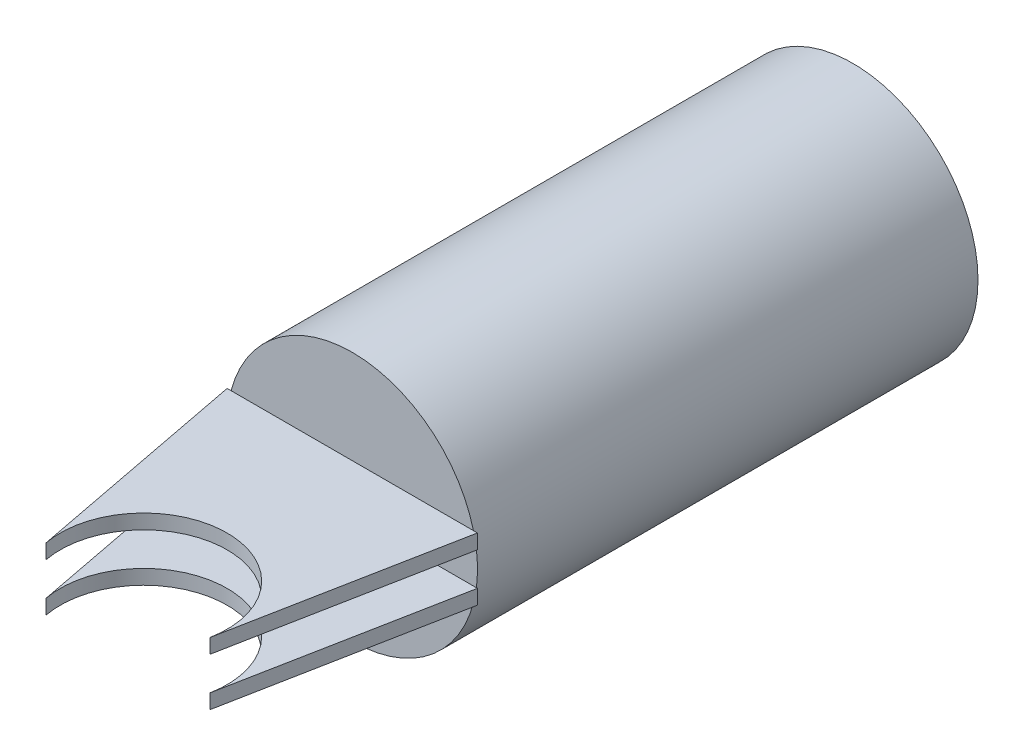
ISO-10303-21;
HEADER;
FILE_DESCRIPTION(('STEP AP214'),'2;1');
FILE_NAME('part.step','',(''),(''),'','','');
FILE_SCHEMA(('AUTOMOTIVE_DESIGN { 1 0 10303 214 1 1 1 1 }'));
ENDSEC;
DATA;
#1=APPLICATION_CONTEXT('core data for automotive mechanical design processes');
#2=APPLICATION_PROTOCOL_DEFINITION('international standard','automotive_design',2000,#1);
#3=PRODUCT_CONTEXT('',#1,'mechanical');
#4=PRODUCT('Part','Part','',(#3));
#5=PRODUCT_RELATED_PRODUCT_CATEGORY('part','',(#4));
#6=PRODUCT_DEFINITION_FORMATION('','',#4);
#7=PRODUCT_DEFINITION_CONTEXT('part definition',#1,'design');
#8=PRODUCT_DEFINITION('design','',#6,#7);
#9=PRODUCT_DEFINITION_SHAPE('','',#8);
#10=(LENGTH_UNIT() NAMED_UNIT(*) SI_UNIT(.MILLI.,.METRE.));
#11=(NAMED_UNIT(*) PLANE_ANGLE_UNIT() SI_UNIT($,.RADIAN.));
#12=(NAMED_UNIT(*) SI_UNIT($,.STERADIAN.) SOLID_ANGLE_UNIT());
#13=UNCERTAINTY_MEASURE_WITH_UNIT(LENGTH_MEASURE(1.E-05),#10,'distance_accuracy_value','');
#14=(GEOMETRIC_REPRESENTATION_CONTEXT(3) GLOBAL_UNCERTAINTY_ASSIGNED_CONTEXT((#13)) GLOBAL_UNIT_ASSIGNED_CONTEXT((#10,
#11,#12)) REPRESENTATION_CONTEXT('',''));
#15=CARTESIAN_POINT('',(0.,0.,0.));
#16=DIRECTION('',(0.,0.,1.));
#17=DIRECTION('',(1.,0.,0.));
#18=AXIS2_PLACEMENT_3D('',#15,#16,#17);
#19=CARTESIAN_POINT('',(0.,0.,0.));
#20=DIRECTION('',(0.,0.,1.));
#21=DIRECTION('',(1.,0.,0.));
#22=AXIS2_PLACEMENT_3D('',#19,#20,#21);
#23=PLANE('',#22);
#24=CARTESIAN_POINT('',(0.,0.,0.));
#25=DIRECTION('',(0.,0.,1.));
#26=DIRECTION('',(1.,0.,0.));
#27=AXIS2_PLACEMENT_3D('',#24,#25,#26);
#28=CIRCLE('',#27,30.);
#29=CARTESIAN_POINT('',(-29.0473750965556,-7.5,0.));
#30=VERTEX_POINT('',#29);
#31=CARTESIAN_POINT('',(29.0473750965556,-7.5,0.));
#32=VERTEX_POINT('',#31);
#33=EDGE_CURVE('E216',#30,#32,#28,.T.);
#34=ORIENTED_EDGE('',*,*,#33,.T.);
#35=DIRECTION('',(-1.,0.,0.));
#36=VECTOR('',#35,1.);
#37=CARTESIAN_POINT('',(30.,-7.5,0.));
#38=LINE('',#37,#36);
#39=EDGE_CURVE('E59',#32,#30,#38,.T.);
#40=ORIENTED_EDGE('',*,*,#39,.T.);
#41=EDGE_LOOP('',(#34,#40));
#42=FACE_BOUND('',#41,.T.);
#43=ADVANCED_FACE('F34',(#42),#23,.T.);
#44=DIRECTION('',(-1.,0.,0.));
#45=VECTOR('',#44,1.);
#46=CARTESIAN_POINT('',(30.,-4.,0.));
#47=LINE('',#46,#45);
#48=CARTESIAN_POINT('',(29.732137494637,-4.,0.));
#49=VERTEX_POINT('',#48);
#50=CARTESIAN_POINT('',(-29.732137494637,-4.,0.));
#51=VERTEX_POINT('',#50);
#52=EDGE_CURVE('E165',#49,#51,#47,.T.);
#53=ORIENTED_EDGE('',*,*,#52,.F.);
#54=CARTESIAN_POINT('',(29.732137494637,4.,0.));
#55=VERTEX_POINT('',#54);
#56=EDGE_CURVE('E202',#49,#55,#28,.T.);
#57=ORIENTED_EDGE('',*,*,#56,.T.);
#58=DIRECTION('',(-1.,0.,0.));
#59=VECTOR('',#58,1.);
#60=CARTESIAN_POINT('',(30.,4.,0.));
#61=LINE('',#60,#59);
#62=CARTESIAN_POINT('',(-29.732137494637,4.,0.));
#63=VERTEX_POINT('',#62);
#64=EDGE_CURVE('E11',#55,#63,#61,.T.);
#65=ORIENTED_EDGE('',*,*,#64,.T.);
#66=EDGE_CURVE('E221',#63,#51,#28,.T.);
#67=ORIENTED_EDGE('',*,*,#66,.T.);
#68=EDGE_LOOP('',(#53,#57,#65,#67));
#69=FACE_BOUND('',#68,.T.);
#70=ADVANCED_FACE('F255',(#69),#23,.T.);
#71=CARTESIAN_POINT('',(0.,0.,-120.));
#72=DIRECTION('',(0.,0.,1.));
#73=DIRECTION('',(1.,0.,0.));
#74=AXIS2_PLACEMENT_3D('',#71,#72,#73);
#75=CYLINDRICAL_SURFACE('',#74,30.);
#76=CARTESIAN_POINT('',(0.,0.,-120.));
#77=DIRECTION('',(0.,0.,1.));
#78=DIRECTION('',(1.,0.,0.));
#79=AXIS2_PLACEMENT_3D('',#76,#77,#78);
#80=CIRCLE('',#79,30.);
#81=CARTESIAN_POINT('',(30.,0.,-120.));
#82=VERTEX_POINT('',#81);
#83=EDGE_CURVE('E203',#82,#82,#80,.T.);
#84=ORIENTED_EDGE('',*,*,#83,.T.);
#85=EDGE_LOOP('',(#84));
#86=FACE_BOUND('',#85,.T.);
#87=CARTESIAN_POINT('',(29.0473750965556,7.5,0.));
#88=VERTEX_POINT('',#87);
#89=EDGE_CURVE('E38',#55,#88,#28,.T.);
#90=ORIENTED_EDGE('',*,*,#89,.F.);
#91=ORIENTED_EDGE('',*,*,#56,.F.);
#92=EDGE_CURVE('E53',#32,#49,#28,.T.);
#93=ORIENTED_EDGE('',*,*,#92,.F.);
#94=ORIENTED_EDGE('',*,*,#33,.F.);
#95=EDGE_CURVE('E219',#51,#30,#28,.T.);
#96=ORIENTED_EDGE('',*,*,#95,.F.);
#97=ORIENTED_EDGE('',*,*,#66,.F.);
#98=CARTESIAN_POINT('',(-29.0473750965556,7.5,0.));
#99=VERTEX_POINT('',#98);
#100=EDGE_CURVE('E213',#99,#63,#28,.T.);
#101=ORIENTED_EDGE('',*,*,#100,.F.);
#102=EDGE_CURVE('E209',#88,#99,#28,.T.);
#103=ORIENTED_EDGE('',*,*,#102,.F.);
#104=EDGE_LOOP('',(#90,#91,#93,#94,#96,#97,#101,#103));
#105=FACE_BOUND('',#104,.T.);
#106=ADVANCED_FACE('F36',(#86,#105),#75,.T.);
#107=CARTESIAN_POINT('',(0.,0.,-120.));
#108=DIRECTION('',(0.,0.,1.));
#109=DIRECTION('',(1.,0.,0.));
#110=AXIS2_PLACEMENT_3D('',#107,#108,#109);
#111=PLANE('',#110);
#112=ORIENTED_EDGE('',*,*,#83,.F.);
#113=EDGE_LOOP('',(#112));
#114=FACE_BOUND('',#113,.T.);
#115=ADVANCED_FACE('F280',(#114),#111,.F.);
#116=DIRECTION('',(-1.,0.,0.));
#117=VECTOR('',#116,1.);
#118=CARTESIAN_POINT('',(30.,7.5,0.));
#119=LINE('',#118,#117);
#120=EDGE_CURVE('E43',#88,#99,#119,.T.);
#121=ORIENTED_EDGE('',*,*,#120,.F.);
#122=ORIENTED_EDGE('',*,*,#102,.T.);
#123=EDGE_LOOP('',(#121,#122));
#124=FACE_BOUND('',#123,.T.);
#125=ADVANCED_FACE('F253',(#124),#23,.T.);
#126=CARTESIAN_POINT('',(30.,7.5,0.));
#127=DIRECTION('',(0.,0.,1.));
#128=DIRECTION('',(1.,0.,0.));
#129=AXIS2_PLACEMENT_3D('',#126,#127,#128);
#130=PLANE('',#129);
#131=CARTESIAN_POINT('',(30.,4.,0.));
#132=VERTEX_POINT('',#131);
#133=EDGE_CURVE('E45',#132,#55,#61,.T.);
#134=ORIENTED_EDGE('',*,*,#133,.T.);
#135=ORIENTED_EDGE('',*,*,#89,.T.);
#136=CARTESIAN_POINT('',(30.,7.5,0.));
#137=VERTEX_POINT('',#136);
#138=EDGE_CURVE('E180',#137,#88,#119,.T.);
#139=ORIENTED_EDGE('',*,*,#138,.F.);
#140=DIRECTION('',(0.,-1.,0.));
#141=VECTOR('',#140,1.);
#142=CARTESIAN_POINT('',(30.,7.5,0.));
#143=LINE('',#142,#141);
#144=EDGE_CURVE('E197',#137,#132,#143,.T.);
#145=ORIENTED_EDGE('',*,*,#144,.T.);
#146=EDGE_LOOP('',(#134,#135,#139,#145));
#147=FACE_BOUND('',#146,.T.);
#148=ADVANCED_FACE('F279',(#147),#130,.F.);
#149=CARTESIAN_POINT('',(-30.,7.5,0.));
#150=VERTEX_POINT('',#149);
#151=EDGE_CURVE('E179',#99,#150,#119,.T.);
#152=ORIENTED_EDGE('',*,*,#151,.F.);
#153=ORIENTED_EDGE('',*,*,#100,.T.);
#154=CARTESIAN_POINT('',(-30.,4.,0.));
#155=VERTEX_POINT('',#154);
#156=EDGE_CURVE('E46',#63,#155,#61,.T.);
#157=ORIENTED_EDGE('',*,*,#156,.T.);
#158=DIRECTION('',(0.,-1.,0.));
#159=VECTOR('',#158,1.);
#160=CARTESIAN_POINT('',(-30.,7.5,0.));
#161=LINE('',#160,#159);
#162=EDGE_CURVE('E194',#150,#155,#161,.T.);
#163=ORIENTED_EDGE('',*,*,#162,.F.);
#164=EDGE_LOOP('',(#152,#153,#157,#163));
#165=FACE_BOUND('',#164,.T.);
#166=ADVANCED_FACE('F232',(#165),#130,.F.);
#167=CARTESIAN_POINT('',(0.,7.5,50.));
#168=DIRECTION('',(0.,-1.,0.));
#169=DIRECTION('',(0.,0.,-1.));
#170=AXIS2_PLACEMENT_3D('',#167,#168,#169);
#171=CYLINDRICAL_SURFACE('',#170,20.);
#172=CARTESIAN_POINT('',(0.,4.,50.));
#173=DIRECTION('',(0.,-1.,0.));
#174=DIRECTION('',(0.,0.,1.));
#175=AXIS2_PLACEMENT_3D('',#172,#173,#174);
#176=CIRCLE('',#175,20.);
#177=CARTESIAN_POINT('',(-19.6388987501519,4.,53.7833392500912));
#178=VERTEX_POINT('',#177);
#179=CARTESIAN_POINT('',(19.6388987501519,4.,53.7833392500912));
#180=VERTEX_POINT('',#179);
#181=EDGE_CURVE('E168',#178,#180,#176,.T.);
#182=ORIENTED_EDGE('',*,*,#181,.T.);
#183=DIRECTION('',(0.,-1.,0.));
#184=VECTOR('',#183,1.);
#185=CARTESIAN_POINT('',(19.6388987501519,7.5,53.7833392500912));
#186=LINE('',#185,#184);
#187=CARTESIAN_POINT('',(19.6388987501519,7.5,53.7833392500912));
#188=VERTEX_POINT('',#187);
#189=EDGE_CURVE('E200',#188,#180,#186,.T.);
#190=ORIENTED_EDGE('',*,*,#189,.F.);
#191=CARTESIAN_POINT('',(0.,7.5,50.));
#192=DIRECTION('',(0.,-1.,0.));
#193=DIRECTION('',(0.,0.,1.));
#194=AXIS2_PLACEMENT_3D('',#191,#192,#193);
#195=CIRCLE('',#194,20.);
#196=CARTESIAN_POINT('',(-19.6388987501519,7.5,53.7833392500912));
#197=VERTEX_POINT('',#196);
#198=EDGE_CURVE('E173',#197,#188,#195,.T.);
#199=ORIENTED_EDGE('',*,*,#198,.F.);
#200=DIRECTION('',(0.,-1.,0.));
#201=VECTOR('',#200,1.);
#202=CARTESIAN_POINT('',(-19.6388987501519,7.5,53.7833392500912));
#203=LINE('',#202,#201);
#204=EDGE_CURVE('E185',#197,#178,#203,.T.);
#205=ORIENTED_EDGE('',*,*,#204,.T.);
#206=EDGE_LOOP('',(#182,#190,#199,#205));
#207=FACE_BOUND('',#206,.T.);
#208=ADVANCED_FACE('F247',(#207),#171,.F.);
#209=CARTESIAN_POINT('',(19.6388987501519,7.5,53.7833392500912));
#210=DIRECTION('',(-0.981944937507597,0.,-0.189166962504558));
#211=DIRECTION('',(-0.189166962504558,0.,0.981944937507597));
#212=AXIS2_PLACEMENT_3D('',#209,#210,#211);
#213=PLANE('',#212);
#214=DIRECTION('',(0.189166962504558,0.,-0.981944937507597));
#215=VECTOR('',#214,1.);
#216=CARTESIAN_POINT('',(19.6388987501519,4.,53.7833392500912));
#217=LINE('',#216,#215);
#218=EDGE_CURVE('E188',#180,#132,#217,.T.);
#219=ORIENTED_EDGE('',*,*,#218,.T.);
#220=ORIENTED_EDGE('',*,*,#144,.F.);
#221=DIRECTION('',(0.189166962504558,0.,-0.981944937507597));
#222=VECTOR('',#221,1.);
#223=CARTESIAN_POINT('',(19.6388987501519,7.5,53.7833392500912));
#224=LINE('',#223,#222);
#225=EDGE_CURVE('E176',#188,#137,#224,.T.);
#226=ORIENTED_EDGE('',*,*,#225,.F.);
#227=ORIENTED_EDGE('',*,*,#189,.T.);
#228=EDGE_LOOP('',(#219,#220,#226,#227));
#229=FACE_BOUND('',#228,.T.);
#230=ADVANCED_FACE('F293',(#229),#213,.F.);
#231=CARTESIAN_POINT('',(-30.,7.5,0.));
#232=DIRECTION('',(0.981944937507597,0.,-0.189166962504558));
#233=DIRECTION('',(-0.189166962504558,0.,-0.981944937507597));
#234=AXIS2_PLACEMENT_3D('',#231,#232,#233);
#235=PLANE('',#234);
#236=DIRECTION('',(0.189166962504558,0.,0.981944937507597));
#237=VECTOR('',#236,1.);
#238=CARTESIAN_POINT('',(-30.,4.,0.));
#239=LINE('',#238,#237);
#240=EDGE_CURVE('E177',#155,#178,#239,.T.);
#241=ORIENTED_EDGE('',*,*,#240,.T.);
#242=ORIENTED_EDGE('',*,*,#204,.F.);
#243=DIRECTION('',(0.189166962504558,0.,0.981944937507597));
#244=VECTOR('',#243,1.);
#245=CARTESIAN_POINT('',(-30.,7.5,0.));
#246=LINE('',#245,#244);
#247=EDGE_CURVE('E183',#150,#197,#246,.T.);
#248=ORIENTED_EDGE('',*,*,#247,.F.);
#249=ORIENTED_EDGE('',*,*,#162,.T.);
#250=EDGE_LOOP('',(#241,#242,#248,#249));
#251=FACE_BOUND('',#250,.T.);
#252=ADVANCED_FACE('F243',(#251),#235,.F.);
#253=CARTESIAN_POINT('',(0.,7.5,50.));
#254=DIRECTION('',(0.,1.,0.));
#255=DIRECTION('',(0.,0.,1.));
#256=AXIS2_PLACEMENT_3D('',#253,#254,#255);
#257=PLANE('',#256);
#258=ORIENTED_EDGE('',*,*,#198,.T.);
#259=ORIENTED_EDGE('',*,*,#225,.T.);
#260=ORIENTED_EDGE('',*,*,#138,.T.);
#261=ORIENTED_EDGE('',*,*,#120,.T.);
#262=ORIENTED_EDGE('',*,*,#151,.T.);
#263=ORIENTED_EDGE('',*,*,#247,.T.);
#264=EDGE_LOOP('',(#258,#259,#260,#261,#262,#263));
#265=FACE_BOUND('',#264,.T.);
#266=ADVANCED_FACE('F250',(#265),#257,.T.);
#267=CARTESIAN_POINT('',(0.,4.,50.));
#268=DIRECTION('',(0.,1.,0.));
#269=DIRECTION('',(0.,0.,1.));
#270=AXIS2_PLACEMENT_3D('',#267,#268,#269);
#271=PLANE('',#270);
#272=ORIENTED_EDGE('',*,*,#181,.F.);
#273=ORIENTED_EDGE('',*,*,#240,.F.);
#274=ORIENTED_EDGE('',*,*,#156,.F.);
#275=ORIENTED_EDGE('',*,*,#64,.F.);
#276=ORIENTED_EDGE('',*,*,#133,.F.);
#277=ORIENTED_EDGE('',*,*,#218,.F.);
#278=EDGE_LOOP('',(#272,#273,#274,#275,#276,#277));
#279=FACE_BOUND('',#278,.T.);
#280=ADVANCED_FACE('F239',(#279),#271,.F.);
#281=CARTESIAN_POINT('',(30.,-7.5,0.));
#282=DIRECTION('',(0.,0.,-1.));
#283=DIRECTION('',(-1.,0.,0.));
#284=AXIS2_PLACEMENT_3D('',#281,#282,#283);
#285=PLANE('',#284);
#286=CARTESIAN_POINT('',(-30.,-4.,0.));
#287=VERTEX_POINT('',#286);
#288=EDGE_CURVE('E163',#51,#287,#47,.T.);
#289=ORIENTED_EDGE('',*,*,#288,.F.);
#290=ORIENTED_EDGE('',*,*,#95,.T.);
#291=CARTESIAN_POINT('',(-30.,-7.5,0.));
#292=VERTEX_POINT('',#291);
#293=EDGE_CURVE('E148',#30,#292,#38,.T.);
#294=ORIENTED_EDGE('',*,*,#293,.T.);
#295=DIRECTION('',(0.,1.,0.));
#296=VECTOR('',#295,1.);
#297=CARTESIAN_POINT('',(-30.,-7.5,0.));
#298=LINE('',#297,#296);
#299=EDGE_CURVE('E169',#292,#287,#298,.T.);
#300=ORIENTED_EDGE('',*,*,#299,.T.);
#301=EDGE_LOOP('',(#289,#290,#294,#300));
#302=FACE_BOUND('',#301,.T.);
#303=ADVANCED_FACE('F260',(#302),#285,.T.);
#304=CARTESIAN_POINT('',(0.,-7.5,50.));
#305=DIRECTION('',(0.,1.,0.));
#306=DIRECTION('',(0.,0.,1.));
#307=AXIS2_PLACEMENT_3D('',#304,#305,#306);
#308=CYLINDRICAL_SURFACE('',#307,20.);
#309=CARTESIAN_POINT('',(0.,-4.,50.));
#310=DIRECTION('',(0.,-1.,0.));
#311=DIRECTION('',(0.,0.,1.));
#312=AXIS2_PLACEMENT_3D('',#309,#310,#311);
#313=CIRCLE('',#312,20.);
#314=CARTESIAN_POINT('',(-19.6388987501519,-4.,53.7833392500912));
#315=VERTEX_POINT('',#314);
#316=CARTESIAN_POINT('',(19.6388987501519,-4.,53.7833392500912));
#317=VERTEX_POINT('',#316);
#318=EDGE_CURVE('E160',#315,#317,#313,.T.);
#319=ORIENTED_EDGE('',*,*,#318,.F.);
#320=DIRECTION('',(0.,1.,0.));
#321=VECTOR('',#320,1.);
#322=CARTESIAN_POINT('',(-19.6388987501519,-7.5,53.7833392500912));
#323=LINE('',#322,#321);
#324=CARTESIAN_POINT('',(-19.6388987501519,-7.5,53.7833392500912));
#325=VERTEX_POINT('',#324);
#326=EDGE_CURVE('E151',#325,#315,#323,.T.);
#327=ORIENTED_EDGE('',*,*,#326,.F.);
#328=CARTESIAN_POINT('',(0.,-7.5,50.));
#329=DIRECTION('',(0.,-1.,0.));
#330=DIRECTION('',(0.,0.,1.));
#331=AXIS2_PLACEMENT_3D('',#328,#329,#330);
#332=CIRCLE('',#331,20.);
#333=CARTESIAN_POINT('',(19.6388987501519,-7.5,53.7833392500912));
#334=VERTEX_POINT('',#333);
#335=EDGE_CURVE('E144',#325,#334,#332,.T.);
#336=ORIENTED_EDGE('',*,*,#335,.T.);
#337=DIRECTION('',(0.,1.,0.));
#338=VECTOR('',#337,1.);
#339=CARTESIAN_POINT('',(19.6388987501519,-7.5,53.7833392500912));
#340=LINE('',#339,#338);
#341=EDGE_CURVE('E126',#334,#317,#340,.T.);
#342=ORIENTED_EDGE('',*,*,#341,.T.);
#343=EDGE_LOOP('',(#319,#327,#336,#342));
#344=FACE_BOUND('',#343,.T.);
#345=ADVANCED_FACE('F150',(#344),#308,.F.);
#346=CARTESIAN_POINT('',(-30.,-7.5,0.));
#347=DIRECTION('',(-0.981944937507597,0.,0.189166962504558));
#348=DIRECTION('',(0.189166962504558,0.,0.981944937507597));
#349=AXIS2_PLACEMENT_3D('',#346,#347,#348);
#350=PLANE('',#349);
#351=DIRECTION('',(0.189166962504558,0.,0.981944937507597));
#352=VECTOR('',#351,1.);
#353=CARTESIAN_POINT('',(-30.,-4.,0.));
#354=LINE('',#353,#352);
#355=EDGE_CURVE('E152',#287,#315,#354,.T.);
#356=ORIENTED_EDGE('',*,*,#355,.F.);
#357=ORIENTED_EDGE('',*,*,#299,.F.);
#358=DIRECTION('',(0.189166962504558,0.,0.981944937507597));
#359=VECTOR('',#358,1.);
#360=CARTESIAN_POINT('',(-30.,-7.5,0.));
#361=LINE('',#360,#359);
#362=EDGE_CURVE('E137',#292,#325,#361,.T.);
#363=ORIENTED_EDGE('',*,*,#362,.T.);
#364=ORIENTED_EDGE('',*,*,#326,.T.);
#365=EDGE_LOOP('',(#356,#357,#363,#364));
#366=FACE_BOUND('',#365,.T.);
#367=ADVANCED_FACE('F262',(#366),#350,.T.);
#368=CARTESIAN_POINT('',(30.,-7.5,0.));
#369=VERTEX_POINT('',#368);
#370=EDGE_CURVE('E147',#369,#32,#38,.T.);
#371=ORIENTED_EDGE('',*,*,#370,.T.);
#372=ORIENTED_EDGE('',*,*,#92,.T.);
#373=CARTESIAN_POINT('',(30.,-4.,0.));
#374=VERTEX_POINT('',#373);
#375=EDGE_CURVE('E155',#374,#49,#47,.T.);
#376=ORIENTED_EDGE('',*,*,#375,.F.);
#377=DIRECTION('',(0.,1.,0.));
#378=VECTOR('',#377,1.);
#379=CARTESIAN_POINT('',(30.,-7.5,0.));
#380=LINE('',#379,#378);
#381=EDGE_CURVE('E136',#369,#374,#380,.T.);
#382=ORIENTED_EDGE('',*,*,#381,.F.);
#383=EDGE_LOOP('',(#371,#372,#376,#382));
#384=FACE_BOUND('',#383,.T.);
#385=ADVANCED_FACE('F263',(#384),#285,.T.);
#386=CARTESIAN_POINT('',(19.6388987501519,-7.5,53.7833392500912));
#387=DIRECTION('',(0.981944937507597,0.,0.189166962504558));
#388=DIRECTION('',(0.189166962504558,0.,-0.981944937507597));
#389=AXIS2_PLACEMENT_3D('',#386,#387,#388);
#390=PLANE('',#389);
#391=DIRECTION('',(0.189166962504558,0.,-0.981944937507597));
#392=VECTOR('',#391,1.);
#393=CARTESIAN_POINT('',(19.6388987501519,-4.,53.7833392500912));
#394=LINE('',#393,#392);
#395=EDGE_CURVE('E131',#317,#374,#394,.T.);
#396=ORIENTED_EDGE('',*,*,#395,.F.);
#397=ORIENTED_EDGE('',*,*,#341,.F.);
#398=DIRECTION('',(0.189166962504558,0.,-0.981944937507597));
#399=VECTOR('',#398,1.);
#400=CARTESIAN_POINT('',(19.6388987501519,-7.5,53.7833392500912));
#401=LINE('',#400,#399);
#402=EDGE_CURVE('E129',#334,#369,#401,.T.);
#403=ORIENTED_EDGE('',*,*,#402,.T.);
#404=ORIENTED_EDGE('',*,*,#381,.T.);
#405=EDGE_LOOP('',(#396,#397,#403,#404));
#406=FACE_BOUND('',#405,.T.);
#407=ADVANCED_FACE('F128',(#406),#390,.T.);
#408=CARTESIAN_POINT('',(0.,-7.5,50.));
#409=DIRECTION('',(0.,1.,0.));
#410=DIRECTION('',(0.,0.,1.));
#411=AXIS2_PLACEMENT_3D('',#408,#409,#410);
#412=PLANE('',#411);
#413=ORIENTED_EDGE('',*,*,#335,.F.);
#414=ORIENTED_EDGE('',*,*,#362,.F.);
#415=ORIENTED_EDGE('',*,*,#293,.F.);
#416=ORIENTED_EDGE('',*,*,#39,.F.);
#417=ORIENTED_EDGE('',*,*,#370,.F.);
#418=ORIENTED_EDGE('',*,*,#402,.F.);
#419=EDGE_LOOP('',(#413,#414,#415,#416,#417,#418));
#420=FACE_BOUND('',#419,.T.);
#421=ADVANCED_FACE('F142',(#420),#412,.F.);
#422=CARTESIAN_POINT('',(0.,-4.,50.));
#423=DIRECTION('',(0.,1.,0.));
#424=DIRECTION('',(0.,0.,1.));
#425=AXIS2_PLACEMENT_3D('',#422,#423,#424);
#426=PLANE('',#425);
#427=ORIENTED_EDGE('',*,*,#318,.T.);
#428=ORIENTED_EDGE('',*,*,#395,.T.);
#429=ORIENTED_EDGE('',*,*,#375,.T.);
#430=ORIENTED_EDGE('',*,*,#52,.T.);
#431=ORIENTED_EDGE('',*,*,#288,.T.);
#432=ORIENTED_EDGE('',*,*,#355,.T.);
#433=EDGE_LOOP('',(#427,#428,#429,#430,#431,#432));
#434=FACE_BOUND('',#433,.T.);
#435=ADVANCED_FACE('F257',(#434),#426,.T.);
#436=CLOSED_SHELL('',(#43,#70,#106,#115,#125,#148,#166,#208,#230,#252,#266,#280,#303,#345,#367,
#385,#407,#421,#435));
#437=MANIFOLD_SOLID_BREP('B2',#436);
#438=ADVANCED_BREP_SHAPE_REPRESENTATION('',(#18,#437),#14);
#439=SHAPE_DEFINITION_REPRESENTATION(#9,#438);
ENDSEC;
END-ISO-10303-21;
